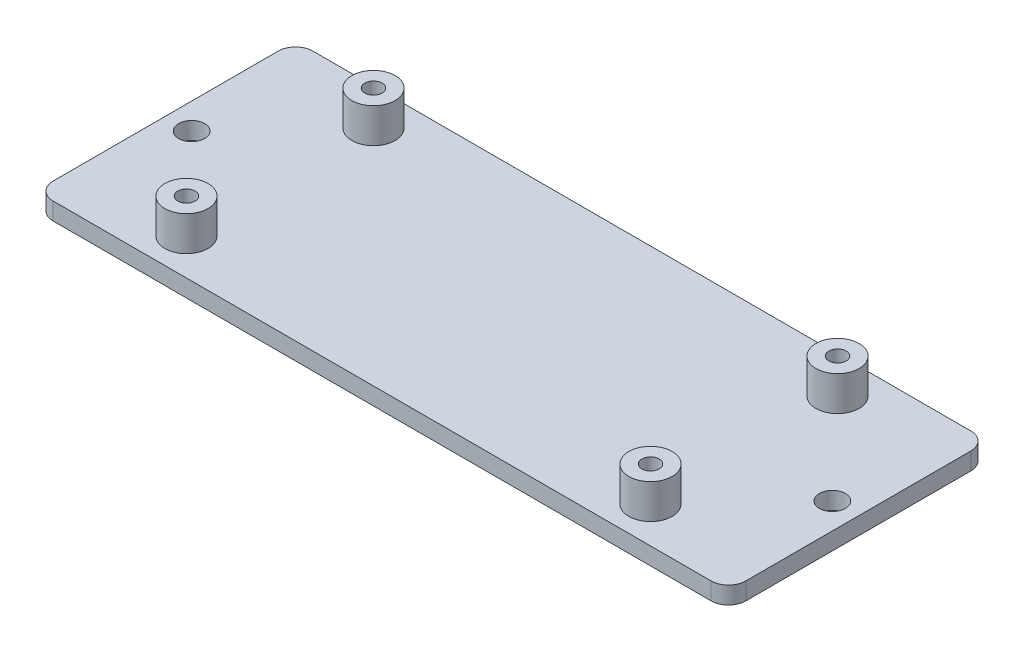
ISO-10303-21;
HEADER;
FILE_DESCRIPTION(('STEP AP214'),'2;1');
FILE_NAME('part.step','',(''),(''),'','','');
FILE_SCHEMA(('AUTOMOTIVE_DESIGN { 1 0 10303 214 1 1 1 1 }'));
ENDSEC;
DATA;
#1=APPLICATION_CONTEXT('core data for automotive mechanical design processes');
#2=APPLICATION_PROTOCOL_DEFINITION('international standard','automotive_design',2000,#1);
#3=PRODUCT_CONTEXT('',#1,'mechanical');
#4=PRODUCT('Part','Part','',(#3));
#5=PRODUCT_RELATED_PRODUCT_CATEGORY('part','',(#4));
#6=PRODUCT_DEFINITION_FORMATION('','',#4);
#7=PRODUCT_DEFINITION_CONTEXT('part definition',#1,'design');
#8=PRODUCT_DEFINITION('design','',#6,#7);
#9=PRODUCT_DEFINITION_SHAPE('','',#8);
#10=(LENGTH_UNIT() NAMED_UNIT(*) SI_UNIT(.MILLI.,.METRE.));
#11=(NAMED_UNIT(*) PLANE_ANGLE_UNIT() SI_UNIT($,.RADIAN.));
#12=(NAMED_UNIT(*) SI_UNIT($,.STERADIAN.) SOLID_ANGLE_UNIT());
#13=UNCERTAINTY_MEASURE_WITH_UNIT(LENGTH_MEASURE(1.E-05),#10,'distance_accuracy_value','');
#14=(GEOMETRIC_REPRESENTATION_CONTEXT(3) GLOBAL_UNCERTAINTY_ASSIGNED_CONTEXT((#13)) GLOBAL_UNIT_ASSIGNED_CONTEXT((#10,
#11,#12)) REPRESENTATION_CONTEXT('',''));
#15=CARTESIAN_POINT('',(0.,0.,0.));
#16=DIRECTION('',(0.,0.,1.));
#17=DIRECTION('',(1.,0.,0.));
#18=AXIS2_PLACEMENT_3D('',#15,#16,#17);
#19=CARTESIAN_POINT('',(2.54,2.54,-35.56));
#20=DIRECTION('',(0.,-1.,0.));
#21=DIRECTION('',(0.,0.,-1.));
#22=AXIS2_PLACEMENT_3D('',#19,#20,#21);
#23=PLANE('',#22);
#24=CARTESIAN_POINT('',(3.81,2.54,-19.05));
#25=DIRECTION('',(0.,1.,0.));
#26=DIRECTION('',(0.,0.,1.));
#27=AXIS2_PLACEMENT_3D('',#24,#25,#26);
#28=CIRCLE('',#27,1.905);
#29=CARTESIAN_POINT('',(3.81,2.54,-17.145));
#30=VERTEX_POINT('',#29);
#31=EDGE_CURVE('E134',#30,#30,#28,.T.);
#32=ORIENTED_EDGE('',*,*,#31,.F.);
#33=EDGE_LOOP('',(#32));
#34=FACE_BOUND('',#33,.T.);
#35=CARTESIAN_POINT('',(2.54,2.54,-35.56));
#36=DIRECTION('',(0.,1.,0.));
#37=DIRECTION('',(0.,0.,-1.));
#38=AXIS2_PLACEMENT_3D('',#35,#36,#37);
#39=CIRCLE('',#38,2.54);
#40=CARTESIAN_POINT('',(2.54000000000002,2.54,-38.1));
#41=VERTEX_POINT('',#40);
#42=CARTESIAN_POINT('',(0.,2.54,-35.56));
#43=VERTEX_POINT('',#42);
#44=EDGE_CURVE('E145',#41,#43,#39,.T.);
#45=ORIENTED_EDGE('',*,*,#44,.T.);
#46=DIRECTION('',(0.,0.,1.));
#47=VECTOR('',#46,1.);
#48=CARTESIAN_POINT('',(0.,2.54,-2.54000000000002));
#49=LINE('',#48,#47);
#50=CARTESIAN_POINT('',(0.,2.54,-2.54000000000002));
#51=VERTEX_POINT('',#50);
#52=EDGE_CURVE('E93',#43,#51,#49,.T.);
#53=ORIENTED_EDGE('',*,*,#52,.T.);
#54=CARTESIAN_POINT('',(2.54,2.54,-2.54));
#55=DIRECTION('',(0.,1.,0.));
#56=DIRECTION('',(0.,0.,-1.));
#57=AXIS2_PLACEMENT_3D('',#54,#55,#56);
#58=CIRCLE('',#57,2.54);
#59=CARTESIAN_POINT('',(2.54000000000002,2.54,0.));
#60=VERTEX_POINT('',#59);
#61=EDGE_CURVE('E275',#51,#60,#58,.T.);
#62=ORIENTED_EDGE('',*,*,#61,.T.);
#63=DIRECTION('',(1.,0.,0.));
#64=VECTOR('',#63,1.);
#65=CARTESIAN_POINT('',(2.54000000000002,2.54,0.));
#66=LINE('',#65,#64);
#67=CARTESIAN_POINT('',(99.06,2.54,0.));
#68=VERTEX_POINT('',#67);
#69=EDGE_CURVE('E281',#60,#68,#66,.T.);
#70=ORIENTED_EDGE('',*,*,#69,.T.);
#71=CARTESIAN_POINT('',(99.06,2.54,-2.54));
#72=DIRECTION('',(0.,1.,0.));
#73=DIRECTION('',(0.,0.,1.));
#74=AXIS2_PLACEMENT_3D('',#71,#72,#73);
#75=CIRCLE('',#74,2.54);
#76=CARTESIAN_POINT('',(101.6,2.54,-2.54000000000002));
#77=VERTEX_POINT('',#76);
#78=EDGE_CURVE('E112',#68,#77,#75,.T.);
#79=ORIENTED_EDGE('',*,*,#78,.T.);
#80=DIRECTION('',(0.,0.,-1.));
#81=VECTOR('',#80,1.);
#82=CARTESIAN_POINT('',(101.6,2.54,-2.54000000000002));
#83=LINE('',#82,#81);
#84=CARTESIAN_POINT('',(101.6,2.54,-35.56));
#85=VERTEX_POINT('',#84);
#86=EDGE_CURVE('E106',#77,#85,#83,.T.);
#87=ORIENTED_EDGE('',*,*,#86,.T.);
#88=CARTESIAN_POINT('',(99.06,2.54,-35.56));
#89=DIRECTION('',(0.,1.,0.));
#90=DIRECTION('',(0.,0.,1.));
#91=AXIS2_PLACEMENT_3D('',#88,#89,#90);
#92=CIRCLE('',#91,2.54);
#93=CARTESIAN_POINT('',(99.06,2.54,-38.1));
#94=VERTEX_POINT('',#93);
#95=EDGE_CURVE('E110',#85,#94,#92,.T.);
#96=ORIENTED_EDGE('',*,*,#95,.T.);
#97=DIRECTION('',(-1.,0.,0.));
#98=VECTOR('',#97,1.);
#99=CARTESIAN_POINT('',(2.54000000000002,2.54,-38.1));
#100=LINE('',#99,#98);
#101=EDGE_CURVE('E49',#94,#41,#100,.T.);
#102=ORIENTED_EDGE('',*,*,#101,.T.);
#103=EDGE_LOOP('',(#45,#53,#62,#70,#79,#87,#96,#102));
#104=FACE_BOUND('',#103,.T.);
#105=CARTESIAN_POINT('',(97.7900000000001,2.54,-19.0500000000002));
#106=DIRECTION('',(0.,1.,0.));
#107=DIRECTION('',(0.,0.,-1.));
#108=AXIS2_PLACEMENT_3D('',#105,#106,#107);
#109=CIRCLE('',#108,1.90500000000001);
#110=CARTESIAN_POINT('',(97.7900000000001,2.54,-20.9550000000002));
#111=VERTEX_POINT('',#110);
#112=EDGE_CURVE('E290',#111,#111,#109,.T.);
#113=ORIENTED_EDGE('',*,*,#112,.F.);
#114=EDGE_LOOP('',(#113));
#115=FACE_BOUND('',#114,.T.);
#116=CARTESIAN_POINT('',(16.764,2.54,-32.766));
#117=DIRECTION('',(0.,-1.,0.));
#118=DIRECTION('',(0.,0.,-1.));
#119=AXIS2_PLACEMENT_3D('',#116,#117,#118);
#120=CIRCLE('',#119,3.175);
#121=CARTESIAN_POINT('',(16.764,2.54,-35.941));
#122=VERTEX_POINT('',#121);
#123=EDGE_CURVE('E160',#122,#122,#120,.F.);
#124=ORIENTED_EDGE('',*,*,#123,.F.);
#125=EDGE_LOOP('',(#124));
#126=FACE_BOUND('',#125,.T.);
#127=CARTESIAN_POINT('',(84.836,2.54,-32.7660000000002));
#128=DIRECTION('',(0.,-1.,0.));
#129=DIRECTION('',(0.,0.,-1.));
#130=AXIS2_PLACEMENT_3D('',#127,#128,#129);
#131=CIRCLE('',#130,3.17500000000001);
#132=CARTESIAN_POINT('',(84.836,2.54,-35.9410000000002));
#133=VERTEX_POINT('',#132);
#134=EDGE_CURVE('E163',#133,#133,#131,.F.);
#135=ORIENTED_EDGE('',*,*,#134,.F.);
#136=EDGE_LOOP('',(#135));
#137=FACE_BOUND('',#136,.T.);
#138=CARTESIAN_POINT('',(84.836,2.54,-5.33399999999978));
#139=DIRECTION('',(0.,-1.,0.));
#140=DIRECTION('',(0.,0.,-1.));
#141=AXIS2_PLACEMENT_3D('',#138,#139,#140);
#142=CIRCLE('',#141,3.17500000000001);
#143=CARTESIAN_POINT('',(84.836,2.54,-8.50899999999979));
#144=VERTEX_POINT('',#143);
#145=EDGE_CURVE('E41',#144,#144,#142,.F.);
#146=ORIENTED_EDGE('',*,*,#145,.F.);
#147=EDGE_LOOP('',(#146));
#148=FACE_BOUND('',#147,.T.);
#149=CARTESIAN_POINT('',(16.764,2.54,-5.334));
#150=DIRECTION('',(0.,-1.,0.));
#151=DIRECTION('',(0.,0.,-1.));
#152=AXIS2_PLACEMENT_3D('',#149,#150,#151);
#153=CIRCLE('',#152,3.175);
#154=CARTESIAN_POINT('',(16.764,2.54,-8.50900000000001));
#155=VERTEX_POINT('',#154);
#156=EDGE_CURVE('E11',#155,#155,#153,.F.);
#157=ORIENTED_EDGE('',*,*,#156,.F.);
#158=EDGE_LOOP('',(#157));
#159=FACE_BOUND('',#158,.T.);
#160=ADVANCED_FACE('F32',(#34,#104,#115,#126,#137,#148,#159),#23,.F.);
#161=CARTESIAN_POINT('',(2.54,0.,-35.56));
#162=DIRECTION('',(0.,-1.,0.));
#163=DIRECTION('',(0.,0.,-1.));
#164=AXIS2_PLACEMENT_3D('',#161,#162,#163);
#165=PLANE('',#164);
#166=CARTESIAN_POINT('',(3.81,0.,-19.05));
#167=DIRECTION('',(0.,1.,0.));
#168=DIRECTION('',(0.,0.,1.));
#169=AXIS2_PLACEMENT_3D('',#166,#167,#168);
#170=CIRCLE('',#169,1.905);
#171=CARTESIAN_POINT('',(3.81,0.,-17.145));
#172=VERTEX_POINT('',#171);
#173=EDGE_CURVE('E287',#172,#172,#170,.T.);
#174=ORIENTED_EDGE('',*,*,#173,.T.);
#175=EDGE_LOOP('',(#174));
#176=FACE_BOUND('',#175,.T.);
#177=CARTESIAN_POINT('',(2.54,0.,-35.56));
#178=DIRECTION('',(0.,1.,0.));
#179=DIRECTION('',(0.,0.,-1.));
#180=AXIS2_PLACEMENT_3D('',#177,#178,#179);
#181=CIRCLE('',#180,2.54);
#182=CARTESIAN_POINT('',(2.54000000000002,0.,-38.1));
#183=VERTEX_POINT('',#182);
#184=CARTESIAN_POINT('',(0.,0.,-35.56));
#185=VERTEX_POINT('',#184);
#186=EDGE_CURVE('E130',#183,#185,#181,.T.);
#187=ORIENTED_EDGE('',*,*,#186,.F.);
#188=DIRECTION('',(-1.,0.,0.));
#189=VECTOR('',#188,1.);
#190=CARTESIAN_POINT('',(2.54000000000002,0.,-38.1));
#191=LINE('',#190,#189);
#192=CARTESIAN_POINT('',(99.06,0.,-38.1));
#193=VERTEX_POINT('',#192);
#194=EDGE_CURVE('E84',#193,#183,#191,.T.);
#195=ORIENTED_EDGE('',*,*,#194,.F.);
#196=CARTESIAN_POINT('',(99.06,0.,-35.56));
#197=DIRECTION('',(0.,1.,0.));
#198=DIRECTION('',(0.,0.,1.));
#199=AXIS2_PLACEMENT_3D('',#196,#197,#198);
#200=CIRCLE('',#199,2.54);
#201=CARTESIAN_POINT('',(101.6,0.,-35.56));
#202=VERTEX_POINT('',#201);
#203=EDGE_CURVE('E78',#202,#193,#200,.T.);
#204=ORIENTED_EDGE('',*,*,#203,.F.);
#205=DIRECTION('',(0.,0.,-1.));
#206=VECTOR('',#205,1.);
#207=CARTESIAN_POINT('',(101.6,0.,-2.54000000000002));
#208=LINE('',#207,#206);
#209=CARTESIAN_POINT('',(101.6,0.,-2.54000000000002));
#210=VERTEX_POINT('',#209);
#211=EDGE_CURVE('E120',#210,#202,#208,.T.);
#212=ORIENTED_EDGE('',*,*,#211,.F.);
#213=CARTESIAN_POINT('',(99.06,0.,-2.54));
#214=DIRECTION('',(0.,1.,0.));
#215=DIRECTION('',(0.,0.,1.));
#216=AXIS2_PLACEMENT_3D('',#213,#214,#215);
#217=CIRCLE('',#216,2.54);
#218=CARTESIAN_POINT('',(99.06,0.,0.));
#219=VERTEX_POINT('',#218);
#220=EDGE_CURVE('E140',#219,#210,#217,.T.);
#221=ORIENTED_EDGE('',*,*,#220,.F.);
#222=DIRECTION('',(1.,0.,0.));
#223=VECTOR('',#222,1.);
#224=CARTESIAN_POINT('',(2.54000000000002,0.,0.));
#225=LINE('',#224,#223);
#226=CARTESIAN_POINT('',(2.54000000000002,0.,0.));
#227=VERTEX_POINT('',#226);
#228=EDGE_CURVE('E138',#227,#219,#225,.T.);
#229=ORIENTED_EDGE('',*,*,#228,.F.);
#230=CARTESIAN_POINT('',(2.54,0.,-2.54));
#231=DIRECTION('',(0.,1.,0.));
#232=DIRECTION('',(0.,0.,-1.));
#233=AXIS2_PLACEMENT_3D('',#230,#231,#232);
#234=CIRCLE('',#233,2.54);
#235=CARTESIAN_POINT('',(0.,0.,-2.54000000000002));
#236=VERTEX_POINT('',#235);
#237=EDGE_CURVE('E136',#236,#227,#234,.T.);
#238=ORIENTED_EDGE('',*,*,#237,.F.);
#239=DIRECTION('',(0.,0.,1.));
#240=VECTOR('',#239,1.);
#241=CARTESIAN_POINT('',(0.,0.,-2.54000000000002));
#242=LINE('',#241,#240);
#243=EDGE_CURVE('E133',#185,#236,#242,.T.);
#244=ORIENTED_EDGE('',*,*,#243,.F.);
#245=EDGE_LOOP('',(#187,#195,#204,#212,#221,#229,#238,#244));
#246=FACE_BOUND('',#245,.T.);
#247=CARTESIAN_POINT('',(97.7900000000001,0.,-19.0500000000002));
#248=DIRECTION('',(0.,1.,0.));
#249=DIRECTION('',(0.,0.,-1.));
#250=AXIS2_PLACEMENT_3D('',#247,#248,#249);
#251=CIRCLE('',#250,1.90500000000001);
#252=CARTESIAN_POINT('',(97.7900000000001,0.,-20.9550000000002));
#253=VERTEX_POINT('',#252);
#254=EDGE_CURVE('E293',#253,#253,#251,.T.);
#255=ORIENTED_EDGE('',*,*,#254,.T.);
#256=EDGE_LOOP('',(#255));
#257=FACE_BOUND('',#256,.T.);
#258=ADVANCED_FACE('F172',(#176,#246,#257),#165,.T.);
#259=CARTESIAN_POINT('',(2.54,2.54,-35.56));
#260=DIRECTION('',(0.,-1.,0.));
#261=DIRECTION('',(0.,0.,-1.));
#262=AXIS2_PLACEMENT_3D('',#259,#260,#261);
#263=CYLINDRICAL_SURFACE('',#262,2.54);
#264=ORIENTED_EDGE('',*,*,#186,.T.);
#265=DIRECTION('',(0.,-1.,0.));
#266=VECTOR('',#265,1.);
#267=CARTESIAN_POINT('',(0.,2.54,-35.56));
#268=LINE('',#267,#266);
#269=EDGE_CURVE('E158',#43,#185,#268,.T.);
#270=ORIENTED_EDGE('',*,*,#269,.F.);
#271=ORIENTED_EDGE('',*,*,#44,.F.);
#272=DIRECTION('',(0.,-1.,0.));
#273=VECTOR('',#272,1.);
#274=CARTESIAN_POINT('',(2.54000000000002,2.54,-38.1));
#275=LINE('',#274,#273);
#276=EDGE_CURVE('E126',#41,#183,#275,.T.);
#277=ORIENTED_EDGE('',*,*,#276,.T.);
#278=EDGE_LOOP('',(#264,#270,#271,#277));
#279=FACE_BOUND('',#278,.T.);
#280=ADVANCED_FACE('F34',(#279),#263,.T.);
#281=CARTESIAN_POINT('',(0.,2.54,-2.54000000000002));
#282=DIRECTION('',(1.,0.,0.));
#283=DIRECTION('',(0.,0.,-1.));
#284=AXIS2_PLACEMENT_3D('',#281,#282,#283);
#285=PLANE('',#284);
#286=ORIENTED_EDGE('',*,*,#243,.T.);
#287=DIRECTION('',(0.,-1.,0.));
#288=VECTOR('',#287,1.);
#289=CARTESIAN_POINT('',(0.,2.54,-2.54000000000002));
#290=LINE('',#289,#288);
#291=EDGE_CURVE('E155',#51,#236,#290,.T.);
#292=ORIENTED_EDGE('',*,*,#291,.F.);
#293=ORIENTED_EDGE('',*,*,#52,.F.);
#294=ORIENTED_EDGE('',*,*,#269,.T.);
#295=EDGE_LOOP('',(#286,#292,#293,#294));
#296=FACE_BOUND('',#295,.T.);
#297=ADVANCED_FACE('F262',(#296),#285,.F.);
#298=CARTESIAN_POINT('',(2.54,2.54,-2.54));
#299=DIRECTION('',(0.,-1.,0.));
#300=DIRECTION('',(0.,0.,-1.));
#301=AXIS2_PLACEMENT_3D('',#298,#299,#300);
#302=CYLINDRICAL_SURFACE('',#301,2.54);
#303=ORIENTED_EDGE('',*,*,#237,.T.);
#304=DIRECTION('',(0.,-1.,0.));
#305=VECTOR('',#304,1.);
#306=CARTESIAN_POINT('',(2.54000000000002,2.54,0.));
#307=LINE('',#306,#305);
#308=EDGE_CURVE('E152',#60,#227,#307,.T.);
#309=ORIENTED_EDGE('',*,*,#308,.F.);
#310=ORIENTED_EDGE('',*,*,#61,.F.);
#311=ORIENTED_EDGE('',*,*,#291,.T.);
#312=EDGE_LOOP('',(#303,#309,#310,#311));
#313=FACE_BOUND('',#312,.T.);
#314=ADVANCED_FACE('F259',(#313),#302,.T.);
#315=CARTESIAN_POINT('',(2.54000000000002,2.54,0.));
#316=DIRECTION('',(0.,0.,-1.));
#317=DIRECTION('',(-1.,0.,0.));
#318=AXIS2_PLACEMENT_3D('',#315,#316,#317);
#319=PLANE('',#318);
#320=ORIENTED_EDGE('',*,*,#228,.T.);
#321=DIRECTION('',(0.,-1.,0.));
#322=VECTOR('',#321,1.);
#323=CARTESIAN_POINT('',(99.06,2.54,0.));
#324=LINE('',#323,#322);
#325=EDGE_CURVE('E149',#68,#219,#324,.T.);
#326=ORIENTED_EDGE('',*,*,#325,.F.);
#327=ORIENTED_EDGE('',*,*,#69,.F.);
#328=ORIENTED_EDGE('',*,*,#308,.T.);
#329=EDGE_LOOP('',(#320,#326,#327,#328));
#330=FACE_BOUND('',#329,.T.);
#331=ADVANCED_FACE('F255',(#330),#319,.F.);
#332=CARTESIAN_POINT('',(99.06,2.54,-2.54));
#333=DIRECTION('',(0.,-1.,0.));
#334=DIRECTION('',(0.,0.,-1.));
#335=AXIS2_PLACEMENT_3D('',#332,#333,#334);
#336=CYLINDRICAL_SURFACE('',#335,2.54);
#337=ORIENTED_EDGE('',*,*,#220,.T.);
#338=DIRECTION('',(0.,-1.,0.));
#339=VECTOR('',#338,1.);
#340=CARTESIAN_POINT('',(101.6,2.54,-2.54000000000002));
#341=LINE('',#340,#339);
#342=EDGE_CURVE('E121',#77,#210,#341,.T.);
#343=ORIENTED_EDGE('',*,*,#342,.F.);
#344=ORIENTED_EDGE('',*,*,#78,.F.);
#345=ORIENTED_EDGE('',*,*,#325,.T.);
#346=EDGE_LOOP('',(#337,#343,#344,#345));
#347=FACE_BOUND('',#346,.T.);
#348=ADVANCED_FACE('F252',(#347),#336,.T.);
#349=CARTESIAN_POINT('',(101.6,2.54,-2.54000000000002));
#350=DIRECTION('',(-1.,0.,0.));
#351=DIRECTION('',(0.,0.,1.));
#352=AXIS2_PLACEMENT_3D('',#349,#350,#351);
#353=PLANE('',#352);
#354=ORIENTED_EDGE('',*,*,#211,.T.);
#355=DIRECTION('',(0.,-1.,0.));
#356=VECTOR('',#355,1.);
#357=CARTESIAN_POINT('',(101.6,2.54,-35.56));
#358=LINE('',#357,#356);
#359=EDGE_CURVE('E117',#85,#202,#358,.T.);
#360=ORIENTED_EDGE('',*,*,#359,.F.);
#361=ORIENTED_EDGE('',*,*,#86,.F.);
#362=ORIENTED_EDGE('',*,*,#342,.T.);
#363=EDGE_LOOP('',(#354,#360,#361,#362));
#364=FACE_BOUND('',#363,.T.);
#365=ADVANCED_FACE('F118',(#364),#353,.F.);
#366=CARTESIAN_POINT('',(99.06,2.54,-35.56));
#367=DIRECTION('',(0.,-1.,0.));
#368=DIRECTION('',(0.,0.,-1.));
#369=AXIS2_PLACEMENT_3D('',#366,#367,#368);
#370=CYLINDRICAL_SURFACE('',#369,2.54);
#371=ORIENTED_EDGE('',*,*,#203,.T.);
#372=DIRECTION('',(0.,-1.,0.));
#373=VECTOR('',#372,1.);
#374=CARTESIAN_POINT('',(99.06,2.54,-38.1));
#375=LINE('',#374,#373);
#376=EDGE_CURVE('E122',#94,#193,#375,.T.);
#377=ORIENTED_EDGE('',*,*,#376,.F.);
#378=ORIENTED_EDGE('',*,*,#95,.F.);
#379=ORIENTED_EDGE('',*,*,#359,.T.);
#380=EDGE_LOOP('',(#371,#377,#378,#379));
#381=FACE_BOUND('',#380,.T.);
#382=ADVANCED_FACE('F124',(#381),#370,.T.);
#383=CARTESIAN_POINT('',(2.54000000000002,2.54,-38.1));
#384=DIRECTION('',(0.,0.,1.));
#385=DIRECTION('',(1.,0.,0.));
#386=AXIS2_PLACEMENT_3D('',#383,#384,#385);
#387=PLANE('',#386);
#388=ORIENTED_EDGE('',*,*,#194,.T.);
#389=ORIENTED_EDGE('',*,*,#276,.F.);
#390=ORIENTED_EDGE('',*,*,#101,.F.);
#391=ORIENTED_EDGE('',*,*,#376,.T.);
#392=EDGE_LOOP('',(#388,#389,#390,#391));
#393=FACE_BOUND('',#392,.T.);
#394=ADVANCED_FACE('F238',(#393),#387,.F.);
#395=CARTESIAN_POINT('',(3.81,2.54,-19.05));
#396=DIRECTION('',(0.,-1.,0.));
#397=DIRECTION('',(0.,0.,-1.));
#398=AXIS2_PLACEMENT_3D('',#395,#396,#397);
#399=CYLINDRICAL_SURFACE('',#398,1.905);
#400=ORIENTED_EDGE('',*,*,#31,.T.);
#401=EDGE_LOOP('',(#400));
#402=FACE_BOUND('',#401,.T.);
#403=ORIENTED_EDGE('',*,*,#173,.F.);
#404=EDGE_LOOP('',(#403));
#405=FACE_BOUND('',#404,.T.);
#406=ADVANCED_FACE('F235',(#402,#405),#399,.F.);
#407=CARTESIAN_POINT('',(97.7900000000001,2.54,-19.0500000000002));
#408=DIRECTION('',(0.,-1.,0.));
#409=DIRECTION('',(0.,0.,-1.));
#410=AXIS2_PLACEMENT_3D('',#407,#408,#409);
#411=CYLINDRICAL_SURFACE('',#410,1.90500000000001);
#412=ORIENTED_EDGE('',*,*,#112,.T.);
#413=EDGE_LOOP('',(#412));
#414=FACE_BOUND('',#413,.T.);
#415=ORIENTED_EDGE('',*,*,#254,.F.);
#416=EDGE_LOOP('',(#415));
#417=FACE_BOUND('',#416,.T.);
#418=ADVANCED_FACE('F228',(#414,#417),#411,.F.);
#419=CARTESIAN_POINT('',(16.764,7.62,-32.766));
#420=DIRECTION('',(0.,1.,0.));
#421=DIRECTION('',(0.,0.,1.));
#422=AXIS2_PLACEMENT_3D('',#419,#420,#421);
#423=PLANE('',#422);
#424=CARTESIAN_POINT('',(16.764,7.62,-32.766));
#425=DIRECTION('',(0.,1.,0.));
#426=DIRECTION('',(0.,0.,1.));
#427=AXIS2_PLACEMENT_3D('',#424,#425,#426);
#428=CIRCLE('',#427,3.175);
#429=CARTESIAN_POINT('',(16.764,7.62,-29.591));
#430=VERTEX_POINT('',#429);
#431=EDGE_CURVE('E296',#430,#430,#428,.T.);
#432=ORIENTED_EDGE('',*,*,#431,.T.);
#433=EDGE_LOOP('',(#432));
#434=FACE_BOUND('',#433,.T.);
#435=CARTESIAN_POINT('',(16.764,7.62,-32.766));
#436=DIRECTION('',(0.,1.,0.));
#437=DIRECTION('',(0.,0.,1.));
#438=AXIS2_PLACEMENT_3D('',#435,#436,#437);
#439=CIRCLE('',#438,1.27);
#440=CARTESIAN_POINT('',(16.764,7.62,-31.496));
#441=VERTEX_POINT('',#440);
#442=EDGE_CURVE('E301',#441,#441,#439,.T.);
#443=ORIENTED_EDGE('',*,*,#442,.F.);
#444=EDGE_LOOP('',(#443));
#445=FACE_BOUND('',#444,.T.);
#446=ADVANCED_FACE('F225',(#434,#445),#423,.T.);
#447=CARTESIAN_POINT('',(16.764,7.62,-32.766));
#448=DIRECTION('',(0.,-1.,0.));
#449=DIRECTION('',(0.,0.,-1.));
#450=AXIS2_PLACEMENT_3D('',#447,#448,#449);
#451=CYLINDRICAL_SURFACE('',#450,3.175);
#452=ORIENTED_EDGE('',*,*,#431,.F.);
#453=EDGE_LOOP('',(#452));
#454=FACE_BOUND('',#453,.T.);
#455=ORIENTED_EDGE('',*,*,#123,.T.);
#456=EDGE_LOOP('',(#455));
#457=FACE_BOUND('',#456,.T.);
#458=ADVANCED_FACE('F223',(#454,#457),#451,.T.);
#459=CARTESIAN_POINT('',(16.764,7.62,-32.766));
#460=DIRECTION('',(0.,-1.,0.));
#461=DIRECTION('',(0.,0.,-1.));
#462=AXIS2_PLACEMENT_3D('',#459,#460,#461);
#463=CYLINDRICAL_SURFACE('',#462,1.27);
#464=ORIENTED_EDGE('',*,*,#442,.T.);
#465=EDGE_LOOP('',(#464));
#466=FACE_BOUND('',#465,.T.);
#467=CARTESIAN_POINT('',(16.764,2.54,-32.766));
#468=DIRECTION('',(0.,1.,0.));
#469=DIRECTION('',(0.,0.,1.));
#470=AXIS2_PLACEMENT_3D('',#467,#468,#469);
#471=CIRCLE('',#470,1.27);
#472=CARTESIAN_POINT('',(16.764,2.54,-31.496));
#473=VERTEX_POINT('',#472);
#474=EDGE_CURVE('E302',#473,#473,#471,.T.);
#475=ORIENTED_EDGE('',*,*,#474,.F.);
#476=EDGE_LOOP('',(#475));
#477=FACE_BOUND('',#476,.T.);
#478=ADVANCED_FACE('F220',(#466,#477),#463,.F.);
#479=ORIENTED_EDGE('',*,*,#474,.T.);
#480=EDGE_LOOP('',(#479));
#481=FACE_BOUND('',#480,.T.);
#482=ADVANCED_FACE('F176',(#481),#23,.F.);
#483=CARTESIAN_POINT('',(84.836,7.62,-32.7660000000002));
#484=DIRECTION('',(0.,-1.,0.));
#485=DIRECTION('',(0.,0.,-1.));
#486=AXIS2_PLACEMENT_3D('',#483,#484,#485);
#487=PLANE('',#486);
#488=CARTESIAN_POINT('',(84.836,7.62,-32.7660000000002));
#489=DIRECTION('',(0.,1.,0.));
#490=DIRECTION('',(0.,0.,-1.));
#491=AXIS2_PLACEMENT_3D('',#488,#489,#490);
#492=CIRCLE('',#491,3.17500000000001);
#493=CARTESIAN_POINT('',(84.836,7.62,-35.9410000000002));
#494=VERTEX_POINT('',#493);
#495=EDGE_CURVE('E305',#494,#494,#492,.T.);
#496=ORIENTED_EDGE('',*,*,#495,.T.);
#497=EDGE_LOOP('',(#496));
#498=FACE_BOUND('',#497,.T.);
#499=CARTESIAN_POINT('',(84.836,7.62,-32.7660000000002));
#500=DIRECTION('',(0.,1.,0.));
#501=DIRECTION('',(0.,0.,1.));
#502=AXIS2_PLACEMENT_3D('',#499,#500,#501);
#503=CIRCLE('',#502,1.26999999999999);
#504=CARTESIAN_POINT('',(84.836,7.62,-31.4960000000002));
#505=VERTEX_POINT('',#504);
#506=EDGE_CURVE('E310',#505,#505,#503,.T.);
#507=ORIENTED_EDGE('',*,*,#506,.F.);
#508=EDGE_LOOP('',(#507));
#509=FACE_BOUND('',#508,.T.);
#510=ADVANCED_FACE('F213',(#498,#509),#487,.F.);
#511=CARTESIAN_POINT('',(84.836,7.62,-32.7660000000002));
#512=DIRECTION('',(0.,-1.,0.));
#513=DIRECTION('',(0.,0.,-1.));
#514=AXIS2_PLACEMENT_3D('',#511,#512,#513);
#515=CYLINDRICAL_SURFACE('',#514,3.17500000000001);
#516=ORIENTED_EDGE('',*,*,#495,.F.);
#517=EDGE_LOOP('',(#516));
#518=FACE_BOUND('',#517,.T.);
#519=ORIENTED_EDGE('',*,*,#134,.T.);
#520=EDGE_LOOP('',(#519));
#521=FACE_BOUND('',#520,.T.);
#522=ADVANCED_FACE('F211',(#518,#521),#515,.T.);
#523=CARTESIAN_POINT('',(84.836,7.62,-32.7660000000002));
#524=DIRECTION('',(0.,-1.,0.));
#525=DIRECTION('',(0.,0.,-1.));
#526=AXIS2_PLACEMENT_3D('',#523,#524,#525);
#527=CYLINDRICAL_SURFACE('',#526,1.26999999999999);
#528=ORIENTED_EDGE('',*,*,#506,.T.);
#529=EDGE_LOOP('',(#528));
#530=FACE_BOUND('',#529,.T.);
#531=CARTESIAN_POINT('',(84.836,2.54,-32.7660000000002));
#532=DIRECTION('',(0.,1.,0.));
#533=DIRECTION('',(0.,0.,1.));
#534=AXIS2_PLACEMENT_3D('',#531,#532,#533);
#535=CIRCLE('',#534,1.26999999999999);
#536=CARTESIAN_POINT('',(84.836,2.54,-31.4960000000002));
#537=VERTEX_POINT('',#536);
#538=EDGE_CURVE('E311',#537,#537,#535,.T.);
#539=ORIENTED_EDGE('',*,*,#538,.F.);
#540=EDGE_LOOP('',(#539));
#541=FACE_BOUND('',#540,.T.);
#542=ADVANCED_FACE('F208',(#530,#541),#527,.F.);
#543=ORIENTED_EDGE('',*,*,#538,.T.);
#544=EDGE_LOOP('',(#543));
#545=FACE_BOUND('',#544,.T.);
#546=ADVANCED_FACE('F203',(#545),#23,.F.);
#547=CARTESIAN_POINT('',(84.836,7.62,-5.33399999999978));
#548=DIRECTION('',(0.,1.,0.));
#549=DIRECTION('',(0.,0.,1.));
#550=AXIS2_PLACEMENT_3D('',#547,#548,#549);
#551=PLANE('',#550);
#552=CARTESIAN_POINT('',(84.836,7.62,-5.33399999999978));
#553=DIRECTION('',(0.,1.,0.));
#554=DIRECTION('',(0.,0.,1.));
#555=AXIS2_PLACEMENT_3D('',#552,#553,#554);
#556=CIRCLE('',#555,3.17500000000001);
#557=CARTESIAN_POINT('',(84.836,7.62,-2.15899999999977));
#558=VERTEX_POINT('',#557);
#559=EDGE_CURVE('E314',#558,#558,#556,.T.);
#560=ORIENTED_EDGE('',*,*,#559,.T.);
#561=EDGE_LOOP('',(#560));
#562=FACE_BOUND('',#561,.T.);
#563=CARTESIAN_POINT('',(84.836,7.62,-5.33399999999978));
#564=DIRECTION('',(0.,1.,0.));
#565=DIRECTION('',(0.,0.,1.));
#566=AXIS2_PLACEMENT_3D('',#563,#564,#565);
#567=CIRCLE('',#566,1.26999999999999);
#568=CARTESIAN_POINT('',(84.836,7.62,-4.06399999999979));
#569=VERTEX_POINT('',#568);
#570=EDGE_CURVE('E319',#569,#569,#567,.T.);
#571=ORIENTED_EDGE('',*,*,#570,.F.);
#572=EDGE_LOOP('',(#571));
#573=FACE_BOUND('',#572,.T.);
#574=ADVANCED_FACE('F200',(#562,#573),#551,.T.);
#575=CARTESIAN_POINT('',(84.836,7.62,-5.33399999999978));
#576=DIRECTION('',(0.,-1.,0.));
#577=DIRECTION('',(0.,0.,-1.));
#578=AXIS2_PLACEMENT_3D('',#575,#576,#577);
#579=CYLINDRICAL_SURFACE('',#578,3.17500000000001);
#580=ORIENTED_EDGE('',*,*,#559,.F.);
#581=EDGE_LOOP('',(#580));
#582=FACE_BOUND('',#581,.T.);
#583=ORIENTED_EDGE('',*,*,#145,.T.);
#584=EDGE_LOOP('',(#583));
#585=FACE_BOUND('',#584,.T.);
#586=ADVANCED_FACE('F168',(#582,#585),#579,.T.);
#587=CARTESIAN_POINT('',(84.836,7.62,-5.33399999999978));
#588=DIRECTION('',(0.,-1.,0.));
#589=DIRECTION('',(0.,0.,-1.));
#590=AXIS2_PLACEMENT_3D('',#587,#588,#589);
#591=CYLINDRICAL_SURFACE('',#590,1.26999999999999);
#592=ORIENTED_EDGE('',*,*,#570,.T.);
#593=EDGE_LOOP('',(#592));
#594=FACE_BOUND('',#593,.T.);
#595=CARTESIAN_POINT('',(84.836,2.54,-5.33399999999978));
#596=DIRECTION('',(0.,1.,0.));
#597=DIRECTION('',(0.,0.,1.));
#598=AXIS2_PLACEMENT_3D('',#595,#596,#597);
#599=CIRCLE('',#598,1.26999999999999);
#600=CARTESIAN_POINT('',(84.836,2.54,-4.06399999999979));
#601=VERTEX_POINT('',#600);
#602=EDGE_CURVE('E320',#601,#601,#599,.T.);
#603=ORIENTED_EDGE('',*,*,#602,.F.);
#604=EDGE_LOOP('',(#603));
#605=FACE_BOUND('',#604,.T.);
#606=ADVANCED_FACE('F196',(#594,#605),#591,.F.);
#607=ORIENTED_EDGE('',*,*,#602,.T.);
#608=EDGE_LOOP('',(#607));
#609=FACE_BOUND('',#608,.T.);
#610=ADVANCED_FACE('F191',(#609),#23,.F.);
#611=CARTESIAN_POINT('',(16.764,7.62,-5.334));
#612=DIRECTION('',(0.,-1.,0.));
#613=DIRECTION('',(0.,0.,-1.));
#614=AXIS2_PLACEMENT_3D('',#611,#612,#613);
#615=PLANE('',#614);
#616=CARTESIAN_POINT('',(16.764,7.62,-5.334));
#617=DIRECTION('',(0.,1.,0.));
#618=DIRECTION('',(0.,0.,-1.));
#619=AXIS2_PLACEMENT_3D('',#616,#617,#618);
#620=CIRCLE('',#619,3.175);
#621=CARTESIAN_POINT('',(16.764,7.62,-8.50900000000001));
#622=VERTEX_POINT('',#621);
#623=EDGE_CURVE('E323',#622,#622,#620,.T.);
#624=ORIENTED_EDGE('',*,*,#623,.T.);
#625=EDGE_LOOP('',(#624));
#626=FACE_BOUND('',#625,.T.);
#627=CARTESIAN_POINT('',(16.764,7.62,-5.334));
#628=DIRECTION('',(0.,1.,0.));
#629=DIRECTION('',(0.,0.,1.));
#630=AXIS2_PLACEMENT_3D('',#627,#628,#629);
#631=CIRCLE('',#630,1.27);
#632=CARTESIAN_POINT('',(16.764,7.62,-4.064));
#633=VERTEX_POINT('',#632);
#634=EDGE_CURVE('E328',#633,#633,#631,.T.);
#635=ORIENTED_EDGE('',*,*,#634,.F.);
#636=EDGE_LOOP('',(#635));
#637=FACE_BOUND('',#636,.T.);
#638=ADVANCED_FACE('F182',(#626,#637),#615,.F.);
#639=CARTESIAN_POINT('',(16.764,7.62,-5.334));
#640=DIRECTION('',(0.,-1.,0.));
#641=DIRECTION('',(0.,0.,-1.));
#642=AXIS2_PLACEMENT_3D('',#639,#640,#641);
#643=CYLINDRICAL_SURFACE('',#642,3.175);
#644=ORIENTED_EDGE('',*,*,#623,.F.);
#645=EDGE_LOOP('',(#644));
#646=FACE_BOUND('',#645,.T.);
#647=ORIENTED_EDGE('',*,*,#156,.T.);
#648=EDGE_LOOP('',(#647));
#649=FACE_BOUND('',#648,.T.);
#650=ADVANCED_FACE('F179',(#646,#649),#643,.T.);
#651=CARTESIAN_POINT('',(16.764,7.62,-5.334));
#652=DIRECTION('',(0.,-1.,0.));
#653=DIRECTION('',(0.,0.,-1.));
#654=AXIS2_PLACEMENT_3D('',#651,#652,#653);
#655=CYLINDRICAL_SURFACE('',#654,1.27);
#656=ORIENTED_EDGE('',*,*,#634,.T.);
#657=EDGE_LOOP('',(#656));
#658=FACE_BOUND('',#657,.T.);
#659=CARTESIAN_POINT('',(16.764,2.54,-5.334));
#660=DIRECTION('',(0.,1.,0.));
#661=DIRECTION('',(0.,0.,1.));
#662=AXIS2_PLACEMENT_3D('',#659,#660,#661);
#663=CIRCLE('',#662,1.27);
#664=CARTESIAN_POINT('',(16.764,2.54,-4.064));
#665=VERTEX_POINT('',#664);
#666=EDGE_CURVE('E329',#665,#665,#663,.T.);
#667=ORIENTED_EDGE('',*,*,#666,.F.);
#668=EDGE_LOOP('',(#667));
#669=FACE_BOUND('',#668,.T.);
#670=ADVANCED_FACE('F181',(#658,#669),#655,.F.);
#671=ORIENTED_EDGE('',*,*,#666,.T.);
#672=EDGE_LOOP('',(#671));
#673=FACE_BOUND('',#672,.T.);
#674=ADVANCED_FACE('F175',(#673),#23,.F.);
#675=CLOSED_SHELL('',(#160,#258,#280,#297,#314,#331,#348,#365,#382,#394,#406,#418,#446,#458,
#478,#482,#510,#522,#542,#546,#574,#586,#606,#610,#638,#650,#670,#674));
#676=MANIFOLD_SOLID_BREP('B2',#675);
#677=ADVANCED_BREP_SHAPE_REPRESENTATION('',(#18,#676),#14);
#678=SHAPE_DEFINITION_REPRESENTATION(#9,#677);
ENDSEC;
END-ISO-10303-21;
